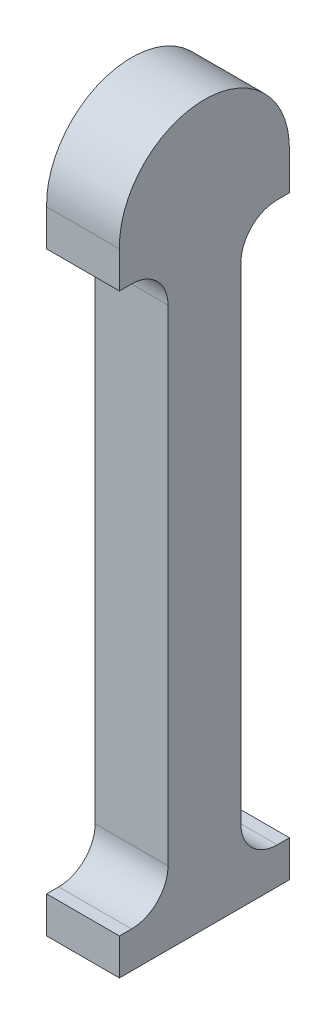
ISO-10303-21;
HEADER;
FILE_DESCRIPTION(('STEP AP214'),'2;1');
FILE_NAME('part.step','',(''),(''),'','','');
FILE_SCHEMA(('AUTOMOTIVE_DESIGN { 1 0 10303 214 1 1 1 1 }'));
ENDSEC;
DATA;
#1=APPLICATION_CONTEXT('core data for automotive mechanical design processes');
#2=APPLICATION_PROTOCOL_DEFINITION('international standard','automotive_design',2000,#1);
#3=PRODUCT_CONTEXT('',#1,'mechanical');
#4=PRODUCT('Part','Part','',(#3));
#5=PRODUCT_RELATED_PRODUCT_CATEGORY('part','',(#4));
#6=PRODUCT_DEFINITION_FORMATION('','',#4);
#7=PRODUCT_DEFINITION_CONTEXT('part definition',#1,'design');
#8=PRODUCT_DEFINITION('design','',#6,#7);
#9=PRODUCT_DEFINITION_SHAPE('','',#8);
#10=(LENGTH_UNIT() NAMED_UNIT(*) SI_UNIT(.MILLI.,.METRE.));
#11=(NAMED_UNIT(*) PLANE_ANGLE_UNIT() SI_UNIT($,.RADIAN.));
#12=(NAMED_UNIT(*) SI_UNIT($,.STERADIAN.) SOLID_ANGLE_UNIT());
#13=UNCERTAINTY_MEASURE_WITH_UNIT(LENGTH_MEASURE(1.E-05),#10,'distance_accuracy_value','');
#14=(GEOMETRIC_REPRESENTATION_CONTEXT(3) GLOBAL_UNCERTAINTY_ASSIGNED_CONTEXT((#13)) GLOBAL_UNIT_ASSIGNED_CONTEXT((#10,
#11,#12)) REPRESENTATION_CONTEXT('',''));
#15=CARTESIAN_POINT('',(0.,0.,0.));
#16=DIRECTION('',(0.,0.,1.));
#17=DIRECTION('',(1.,0.,0.));
#18=AXIS2_PLACEMENT_3D('',#15,#16,#17);
#19=CARTESIAN_POINT('',(1.5,23.,1.5));
#20=DIRECTION('',(-1.,0.,0.));
#21=DIRECTION('',(0.,0.,1.));
#22=AXIS2_PLACEMENT_3D('',#19,#20,#21);
#23=PLANE('',#22);
#24=DIRECTION('',(0.,0.,-1.));
#25=VECTOR('',#24,1.);
#26=CARTESIAN_POINT('',(1.5,23.,-3.5));
#27=LINE('',#26,#25);
#28=CARTESIAN_POINT('',(1.5,23.,3.5));
#29=VERTEX_POINT('',#28);
#30=CARTESIAN_POINT('',(1.5,23.,3.));
#31=VERTEX_POINT('',#30);
#32=EDGE_CURVE('E235',#29,#31,#27,.T.);
#33=ORIENTED_EDGE('',*,*,#32,.T.);
#34=CARTESIAN_POINT('',(1.5,21.5,3.));
#35=DIRECTION('',(-1.,0.,0.));
#36=DIRECTION('',(0.,0.,1.));
#37=AXIS2_PLACEMENT_3D('',#34,#35,#36);
#38=CIRCLE('',#37,1.5);
#39=CARTESIAN_POINT('',(1.5,21.5,1.5));
#40=VERTEX_POINT('',#39);
#41=EDGE_CURVE('E48',#31,#40,#38,.T.);
#42=ORIENTED_EDGE('',*,*,#41,.T.);
#43=DIRECTION('',(0.,-1.,0.));
#44=VECTOR('',#43,1.);
#45=CARTESIAN_POINT('',(1.5,23.,1.5));
#46=LINE('',#45,#44);
#47=CARTESIAN_POINT('',(1.5,1.5,1.5));
#48=VERTEX_POINT('',#47);
#49=EDGE_CURVE('E255',#40,#48,#46,.T.);
#50=ORIENTED_EDGE('',*,*,#49,.T.);
#51=CARTESIAN_POINT('',(1.5,1.5,3.));
#52=DIRECTION('',(-1.,0.,0.));
#53=DIRECTION('',(0.,0.,1.));
#54=AXIS2_PLACEMENT_3D('',#51,#52,#53);
#55=CIRCLE('',#54,1.5);
#56=CARTESIAN_POINT('',(1.5,0.,3.));
#57=VERTEX_POINT('',#56);
#58=EDGE_CURVE('E298',#48,#57,#55,.T.);
#59=ORIENTED_EDGE('',*,*,#58,.T.);
#60=DIRECTION('',(0.,0.,-1.));
#61=VECTOR('',#60,1.);
#62=CARTESIAN_POINT('',(1.5,0.,-3.5));
#63=LINE('',#62,#61);
#64=CARTESIAN_POINT('',(1.5,0.,3.5));
#65=VERTEX_POINT('',#64);
#66=EDGE_CURVE('E202',#65,#57,#63,.T.);
#67=ORIENTED_EDGE('',*,*,#66,.F.);
#68=DIRECTION('',(0.,1.,0.));
#69=VECTOR('',#68,1.);
#70=CARTESIAN_POINT('',(1.5,-1.5,3.5));
#71=LINE('',#70,#69);
#72=CARTESIAN_POINT('',(1.5,-1.5,3.5));
#73=VERTEX_POINT('',#72);
#74=EDGE_CURVE('E228',#73,#65,#71,.T.);
#75=ORIENTED_EDGE('',*,*,#74,.F.);
#76=DIRECTION('',(0.,0.,-1.));
#77=VECTOR('',#76,1.);
#78=CARTESIAN_POINT('',(1.5,-1.5,-3.5));
#79=LINE('',#78,#77);
#80=CARTESIAN_POINT('',(1.5,-1.5,-3.5));
#81=VERTEX_POINT('',#80);
#82=EDGE_CURVE('E184',#73,#81,#79,.T.);
#83=ORIENTED_EDGE('',*,*,#82,.T.);
#84=DIRECTION('',(0.,1.,0.));
#85=VECTOR('',#84,1.);
#86=CARTESIAN_POINT('',(1.5,-1.5,-3.5));
#87=LINE('',#86,#85);
#88=CARTESIAN_POINT('',(1.5,0.,-3.5));
#89=VERTEX_POINT('',#88);
#90=EDGE_CURVE('E201',#81,#89,#87,.T.);
#91=ORIENTED_EDGE('',*,*,#90,.T.);
#92=CARTESIAN_POINT('',(1.5,0.,-3.));
#93=VERTEX_POINT('',#92);
#94=EDGE_CURVE('E181',#93,#89,#63,.T.);
#95=ORIENTED_EDGE('',*,*,#94,.F.);
#96=CARTESIAN_POINT('',(1.5,1.5,-3.));
#97=DIRECTION('',(-1.,0.,0.));
#98=DIRECTION('',(0.,0.,1.));
#99=AXIS2_PLACEMENT_3D('',#96,#97,#98);
#100=CIRCLE('',#99,1.5);
#101=CARTESIAN_POINT('',(1.5,1.5,-1.5));
#102=VERTEX_POINT('',#101);
#103=EDGE_CURVE('E307',#93,#102,#100,.T.);
#104=ORIENTED_EDGE('',*,*,#103,.T.);
#105=DIRECTION('',(0.,-1.,0.));
#106=VECTOR('',#105,1.);
#107=CARTESIAN_POINT('',(1.5,23.,-1.5));
#108=LINE('',#107,#106);
#109=CARTESIAN_POINT('',(1.5,21.5,-1.5));
#110=VERTEX_POINT('',#109);
#111=EDGE_CURVE('E267',#110,#102,#108,.T.);
#112=ORIENTED_EDGE('',*,*,#111,.F.);
#113=CARTESIAN_POINT('',(1.5,21.5,-3.));
#114=DIRECTION('',(-1.,0.,0.));
#115=DIRECTION('',(0.,0.,1.));
#116=AXIS2_PLACEMENT_3D('',#113,#114,#115);
#117=CIRCLE('',#116,1.5);
#118=CARTESIAN_POINT('',(1.5,23.,-3.));
#119=VERTEX_POINT('',#118);
#120=EDGE_CURVE('E313',#110,#119,#117,.T.);
#121=ORIENTED_EDGE('',*,*,#120,.T.);
#122=CARTESIAN_POINT('',(1.5,23.,-3.5));
#123=VERTEX_POINT('',#122);
#124=EDGE_CURVE('E231',#119,#123,#27,.T.);
#125=ORIENTED_EDGE('',*,*,#124,.T.);
#126=DIRECTION('',(0.,-1.,0.));
#127=VECTOR('',#126,1.);
#128=CARTESIAN_POINT('',(1.5,24.5,-3.5));
#129=LINE('',#128,#127);
#130=CARTESIAN_POINT('',(1.5,24.5,-3.5));
#131=VERTEX_POINT('',#130);
#132=EDGE_CURVE('E251',#131,#123,#129,.T.);
#133=ORIENTED_EDGE('',*,*,#132,.F.);
#134=CARTESIAN_POINT('',(1.5,24.5767224444418,0.));
#135=DIRECTION('',(-1.,0.,0.));
#136=DIRECTION('',(0.,0.,1.));
#137=AXIS2_PLACEMENT_3D('',#134,#135,#136);
#138=CIRCLE('',#137,3.50084080379002);
#139=CARTESIAN_POINT('',(1.5,24.5,3.5));
#140=VERTEX_POINT('',#139);
#141=EDGE_CURVE('E178',#140,#131,#138,.T.);
#142=ORIENTED_EDGE('',*,*,#141,.F.);
#143=DIRECTION('',(0.,-1.,0.));
#144=VECTOR('',#143,1.);
#145=CARTESIAN_POINT('',(1.5,24.5,3.5));
#146=LINE('',#145,#144);
#147=EDGE_CURVE('E158',#140,#29,#146,.T.);
#148=ORIENTED_EDGE('',*,*,#147,.T.);
#149=EDGE_LOOP('',(#33,#42,#50,#59,#67,#75,#83,#91,#95,#104,#112,#121,#125,#133,#142,#148));
#150=FACE_BOUND('',#149,.T.);
#151=ADVANCED_FACE('F39',(#150),#23,.F.);
#152=CARTESIAN_POINT('',(-1.5,23.,-1.5));
#153=DIRECTION('',(0.,0.,1.));
#154=DIRECTION('',(1.,0.,0.));
#155=AXIS2_PLACEMENT_3D('',#152,#153,#154);
#156=PLANE('',#155);
#157=ORIENTED_EDGE('',*,*,#111,.T.);
#158=DIRECTION('',(-1.,0.,0.));
#159=VECTOR('',#158,1.);
#160=CARTESIAN_POINT('',(-1.5,1.5,-1.5));
#161=LINE('',#160,#159);
#162=CARTESIAN_POINT('',(-1.5,1.5,-1.5));
#163=VERTEX_POINT('',#162);
#164=EDGE_CURVE('E284',#102,#163,#161,.T.);
#165=ORIENTED_EDGE('',*,*,#164,.T.);
#166=DIRECTION('',(0.,-1.,0.));
#167=VECTOR('',#166,1.);
#168=CARTESIAN_POINT('',(-1.5,23.,-1.5));
#169=LINE('',#168,#167);
#170=CARTESIAN_POINT('',(-1.5,21.5,-1.5));
#171=VERTEX_POINT('',#170);
#172=EDGE_CURVE('E263',#171,#163,#169,.T.);
#173=ORIENTED_EDGE('',*,*,#172,.F.);
#174=DIRECTION('',(-1.,0.,0.));
#175=VECTOR('',#174,1.);
#176=CARTESIAN_POINT('',(1.5,21.5,-1.5));
#177=LINE('',#176,#175);
#178=EDGE_CURVE('E281',#171,#110,#177,.F.);
#179=ORIENTED_EDGE('',*,*,#178,.T.);
#180=EDGE_LOOP('',(#157,#165,#173,#179));
#181=FACE_BOUND('',#180,.T.);
#182=ADVANCED_FACE('F346',(#181),#156,.F.);
#183=CARTESIAN_POINT('',(-1.5,23.,1.5));
#184=DIRECTION('',(1.,0.,0.));
#185=DIRECTION('',(0.,0.,-1.));
#186=AXIS2_PLACEMENT_3D('',#183,#184,#185);
#187=PLANE('',#186);
#188=DIRECTION('',(0.,0.,1.));
#189=VECTOR('',#188,1.);
#190=CARTESIAN_POINT('',(-1.5,23.,-3.5));
#191=LINE('',#190,#189);
#192=CARTESIAN_POINT('',(-1.5,23.,-3.5));
#193=VERTEX_POINT('',#192);
#194=CARTESIAN_POINT('',(-1.5,23.,-3.));
#195=VERTEX_POINT('',#194);
#196=EDGE_CURVE('E242',#193,#195,#191,.T.);
#197=ORIENTED_EDGE('',*,*,#196,.T.);
#198=CARTESIAN_POINT('',(-1.5,21.5,-3.));
#199=DIRECTION('',(1.,0.,0.));
#200=DIRECTION('',(0.,0.,-1.));
#201=AXIS2_PLACEMENT_3D('',#198,#199,#200);
#202=CIRCLE('',#201,1.5);
#203=EDGE_CURVE('E310',#195,#171,#202,.T.);
#204=ORIENTED_EDGE('',*,*,#203,.T.);
#205=ORIENTED_EDGE('',*,*,#172,.T.);
#206=CARTESIAN_POINT('',(-1.5,1.5,-3.));
#207=DIRECTION('',(1.,0.,0.));
#208=DIRECTION('',(0.,0.,-1.));
#209=AXIS2_PLACEMENT_3D('',#206,#207,#208);
#210=CIRCLE('',#209,1.5);
#211=CARTESIAN_POINT('',(-1.5,0.,-3.));
#212=VERTEX_POINT('',#211);
#213=EDGE_CURVE('E304',#163,#212,#210,.T.);
#214=ORIENTED_EDGE('',*,*,#213,.T.);
#215=DIRECTION('',(0.,0.,1.));
#216=VECTOR('',#215,1.);
#217=CARTESIAN_POINT('',(-1.5,0.,-3.5));
#218=LINE('',#217,#216);
#219=CARTESIAN_POINT('',(-1.5,0.,-3.5));
#220=VERTEX_POINT('',#219);
#221=EDGE_CURVE('E211',#220,#212,#218,.T.);
#222=ORIENTED_EDGE('',*,*,#221,.F.);
#223=DIRECTION('',(0.,1.,0.));
#224=VECTOR('',#223,1.);
#225=CARTESIAN_POINT('',(-1.5,-1.5,-3.5));
#226=LINE('',#225,#224);
#227=CARTESIAN_POINT('',(-1.5,-1.5,-3.5));
#228=VERTEX_POINT('',#227);
#229=EDGE_CURVE('E221',#228,#220,#226,.T.);
#230=ORIENTED_EDGE('',*,*,#229,.F.);
#231=DIRECTION('',(0.,0.,1.));
#232=VECTOR('',#231,1.);
#233=CARTESIAN_POINT('',(-1.5,-1.5,-3.5));
#234=LINE('',#233,#232);
#235=CARTESIAN_POINT('',(-1.5,-1.5,3.5));
#236=VERTEX_POINT('',#235);
#237=EDGE_CURVE('E193',#228,#236,#234,.T.);
#238=ORIENTED_EDGE('',*,*,#237,.T.);
#239=DIRECTION('',(0.,1.,0.));
#240=VECTOR('',#239,1.);
#241=CARTESIAN_POINT('',(-1.5,-1.5,3.5));
#242=LINE('',#241,#240);
#243=CARTESIAN_POINT('',(-1.5,0.,3.5));
#244=VERTEX_POINT('',#243);
#245=EDGE_CURVE('E224',#236,#244,#242,.T.);
#246=ORIENTED_EDGE('',*,*,#245,.T.);
#247=CARTESIAN_POINT('',(-1.5,0.,3.));
#248=VERTEX_POINT('',#247);
#249=EDGE_CURVE('E210',#248,#244,#218,.T.);
#250=ORIENTED_EDGE('',*,*,#249,.F.);
#251=CARTESIAN_POINT('',(-1.5,1.5,3.));
#252=DIRECTION('',(1.,0.,0.));
#253=DIRECTION('',(0.,0.,-1.));
#254=AXIS2_PLACEMENT_3D('',#251,#252,#253);
#255=CIRCLE('',#254,1.5);
#256=CARTESIAN_POINT('',(-1.5,1.5,1.5));
#257=VERTEX_POINT('',#256);
#258=EDGE_CURVE('E301',#248,#257,#255,.T.);
#259=ORIENTED_EDGE('',*,*,#258,.T.);
#260=DIRECTION('',(0.,-1.,0.));
#261=VECTOR('',#260,1.);
#262=CARTESIAN_POINT('',(-1.5,23.,1.5));
#263=LINE('',#262,#261);
#264=CARTESIAN_POINT('',(-1.5,21.5,1.5));
#265=VERTEX_POINT('',#264);
#266=EDGE_CURVE('E259',#265,#257,#263,.T.);
#267=ORIENTED_EDGE('',*,*,#266,.F.);
#268=CARTESIAN_POINT('',(-1.5,21.5,3.));
#269=DIRECTION('',(1.,0.,0.));
#270=DIRECTION('',(0.,0.,-1.));
#271=AXIS2_PLACEMENT_3D('',#268,#269,#270);
#272=CIRCLE('',#271,1.5);
#273=CARTESIAN_POINT('',(-1.5,23.,3.));
#274=VERTEX_POINT('',#273);
#275=EDGE_CURVE('E11',#265,#274,#272,.T.);
#276=ORIENTED_EDGE('',*,*,#275,.T.);
#277=CARTESIAN_POINT('',(-1.5,23.,3.5));
#278=VERTEX_POINT('',#277);
#279=EDGE_CURVE('E171',#274,#278,#191,.T.);
#280=ORIENTED_EDGE('',*,*,#279,.T.);
#281=DIRECTION('',(0.,-1.,0.));
#282=VECTOR('',#281,1.);
#283=CARTESIAN_POINT('',(-1.5,24.5,3.5));
#284=LINE('',#283,#282);
#285=CARTESIAN_POINT('',(-1.5,24.5,3.5));
#286=VERTEX_POINT('',#285);
#287=EDGE_CURVE('E155',#286,#278,#284,.T.);
#288=ORIENTED_EDGE('',*,*,#287,.F.);
#289=CARTESIAN_POINT('',(-1.5,24.5767224444418,0.));
#290=DIRECTION('',(-1.,0.,0.));
#291=DIRECTION('',(0.,0.,1.));
#292=AXIS2_PLACEMENT_3D('',#289,#290,#291);
#293=CIRCLE('',#292,3.50084080379002);
#294=CARTESIAN_POINT('',(-1.5,24.5,-3.5));
#295=VERTEX_POINT('',#294);
#296=EDGE_CURVE('E170',#286,#295,#293,.T.);
#297=ORIENTED_EDGE('',*,*,#296,.T.);
#298=DIRECTION('',(0.,-1.,0.));
#299=VECTOR('',#298,1.);
#300=CARTESIAN_POINT('',(-1.5,24.5,-3.5));
#301=LINE('',#300,#299);
#302=EDGE_CURVE('E173',#295,#193,#301,.T.);
#303=ORIENTED_EDGE('',*,*,#302,.T.);
#304=EDGE_LOOP('',(#197,#204,#205,#214,#222,#230,#238,#246,#250,#259,#267,#276,#280,#288,#297,#303));
#305=FACE_BOUND('',#304,.T.);
#306=ADVANCED_FACE('F168',(#305),#187,.F.);
#307=CARTESIAN_POINT('',(-1.5,23.,1.5));
#308=DIRECTION('',(0.,0.,-1.));
#309=DIRECTION('',(-1.,0.,0.));
#310=AXIS2_PLACEMENT_3D('',#307,#308,#309);
#311=PLANE('',#310);
#312=ORIENTED_EDGE('',*,*,#266,.T.);
#313=DIRECTION('',(1.,0.,0.));
#314=VECTOR('',#313,1.);
#315=CARTESIAN_POINT('',(1.5,1.5,1.5));
#316=LINE('',#315,#314);
#317=EDGE_CURVE('E274',#257,#48,#316,.T.);
#318=ORIENTED_EDGE('',*,*,#317,.T.);
#319=ORIENTED_EDGE('',*,*,#49,.F.);
#320=DIRECTION('',(1.,0.,0.));
#321=VECTOR('',#320,1.);
#322=CARTESIAN_POINT('',(-1.5,21.5,1.5));
#323=LINE('',#322,#321);
#324=EDGE_CURVE('E271',#40,#265,#323,.F.);
#325=ORIENTED_EDGE('',*,*,#324,.T.);
#326=EDGE_LOOP('',(#312,#318,#319,#325));
#327=FACE_BOUND('',#326,.T.);
#328=ADVANCED_FACE('F320',(#327),#311,.F.);
#329=CARTESIAN_POINT('',(0.,23.,0.));
#330=DIRECTION('',(0.,1.,0.));
#331=DIRECTION('',(0.,0.,1.));
#332=AXIS2_PLACEMENT_3D('',#329,#330,#331);
#333=PLANE('',#332);
#334=ORIENTED_EDGE('',*,*,#124,.F.);
#335=DIRECTION('',(-1.,0.,0.));
#336=VECTOR('',#335,1.);
#337=CARTESIAN_POINT('',(-1.5,23.,-3.));
#338=LINE('',#337,#336);
#339=EDGE_CURVE('E291',#119,#195,#338,.T.);
#340=ORIENTED_EDGE('',*,*,#339,.T.);
#341=ORIENTED_EDGE('',*,*,#196,.F.);
#342=DIRECTION('',(-1.,0.,0.));
#343=VECTOR('',#342,1.);
#344=CARTESIAN_POINT('',(-1.5,23.,-3.5));
#345=LINE('',#344,#343);
#346=EDGE_CURVE('E239',#123,#193,#345,.T.);
#347=ORIENTED_EDGE('',*,*,#346,.F.);
#348=EDGE_LOOP('',(#334,#340,#341,#347));
#349=FACE_BOUND('',#348,.T.);
#350=ADVANCED_FACE('F356',(#349),#333,.F.);
#351=ORIENTED_EDGE('',*,*,#279,.F.);
#352=DIRECTION('',(1.,0.,0.));
#353=VECTOR('',#352,1.);
#354=CARTESIAN_POINT('',(1.5,23.,3.));
#355=LINE('',#354,#353);
#356=EDGE_CURVE('E295',#274,#31,#355,.T.);
#357=ORIENTED_EDGE('',*,*,#356,.T.);
#358=ORIENTED_EDGE('',*,*,#32,.F.);
#359=DIRECTION('',(1.,0.,0.));
#360=VECTOR('',#359,1.);
#361=CARTESIAN_POINT('',(-1.5,23.,3.5));
#362=LINE('',#361,#360);
#363=EDGE_CURVE('E233',#278,#29,#362,.T.);
#364=ORIENTED_EDGE('',*,*,#363,.F.);
#365=EDGE_LOOP('',(#351,#357,#358,#364));
#366=FACE_BOUND('',#365,.T.);
#367=ADVANCED_FACE('F323',(#366),#333,.F.);
#368=CARTESIAN_POINT('',(-1.5,24.5,-3.5));
#369=DIRECTION('',(0.,0.,1.));
#370=DIRECTION('',(1.,0.,0.));
#371=AXIS2_PLACEMENT_3D('',#368,#369,#370);
#372=PLANE('',#371);
#373=ORIENTED_EDGE('',*,*,#346,.T.);
#374=ORIENTED_EDGE('',*,*,#302,.F.);
#375=DIRECTION('',(-1.,0.,0.));
#376=VECTOR('',#375,1.);
#377=CARTESIAN_POINT('',(-1.5,24.5,-3.5));
#378=LINE('',#377,#376);
#379=EDGE_CURVE('E164',#131,#295,#378,.T.);
#380=ORIENTED_EDGE('',*,*,#379,.F.);
#381=ORIENTED_EDGE('',*,*,#132,.T.);
#382=EDGE_LOOP('',(#373,#374,#380,#381));
#383=FACE_BOUND('',#382,.T.);
#384=ADVANCED_FACE('F359',(#383),#372,.F.);
#385=CARTESIAN_POINT('',(-1.5,24.5,3.5));
#386=DIRECTION('',(0.,0.,-1.));
#387=DIRECTION('',(-1.,0.,0.));
#388=AXIS2_PLACEMENT_3D('',#385,#386,#387);
#389=PLANE('',#388);
#390=ORIENTED_EDGE('',*,*,#363,.T.);
#391=ORIENTED_EDGE('',*,*,#147,.F.);
#392=DIRECTION('',(1.,0.,0.));
#393=VECTOR('',#392,1.);
#394=CARTESIAN_POINT('',(-1.5,24.5,3.5));
#395=LINE('',#394,#393);
#396=EDGE_CURVE('E152',#286,#140,#395,.T.);
#397=ORIENTED_EDGE('',*,*,#396,.F.);
#398=ORIENTED_EDGE('',*,*,#287,.T.);
#399=EDGE_LOOP('',(#390,#391,#397,#398));
#400=FACE_BOUND('',#399,.T.);
#401=ADVANCED_FACE('F154',(#400),#389,.F.);
#402=CARTESIAN_POINT('',(0.,0.,0.));
#403=DIRECTION('',(0.,-1.,0.));
#404=DIRECTION('',(0.,0.,1.));
#405=AXIS2_PLACEMENT_3D('',#402,#403,#404);
#406=PLANE('',#405);
#407=ORIENTED_EDGE('',*,*,#66,.T.);
#408=DIRECTION('',(1.,0.,0.));
#409=VECTOR('',#408,1.);
#410=CARTESIAN_POINT('',(-1.5,0.,3.));
#411=LINE('',#410,#409);
#412=EDGE_CURVE('E278',#57,#248,#411,.F.);
#413=ORIENTED_EDGE('',*,*,#412,.T.);
#414=ORIENTED_EDGE('',*,*,#249,.T.);
#415=DIRECTION('',(1.,0.,0.));
#416=VECTOR('',#415,1.);
#417=CARTESIAN_POINT('',(-1.5,0.,3.5));
#418=LINE('',#417,#416);
#419=EDGE_CURVE('E206',#244,#65,#418,.T.);
#420=ORIENTED_EDGE('',*,*,#419,.T.);
#421=EDGE_LOOP('',(#407,#413,#414,#420));
#422=FACE_BOUND('',#421,.T.);
#423=ADVANCED_FACE('F366',(#422),#406,.F.);
#424=CARTESIAN_POINT('',(-1.5,-1.5,3.5));
#425=DIRECTION('',(0.,0.,1.));
#426=DIRECTION('',(1.,0.,0.));
#427=AXIS2_PLACEMENT_3D('',#424,#425,#426);
#428=PLANE('',#427);
#429=ORIENTED_EDGE('',*,*,#419,.F.);
#430=ORIENTED_EDGE('',*,*,#245,.F.);
#431=DIRECTION('',(1.,0.,0.));
#432=VECTOR('',#431,1.);
#433=CARTESIAN_POINT('',(-1.5,-1.5,3.5));
#434=LINE('',#433,#432);
#435=EDGE_CURVE('E188',#236,#73,#434,.T.);
#436=ORIENTED_EDGE('',*,*,#435,.T.);
#437=ORIENTED_EDGE('',*,*,#74,.T.);
#438=EDGE_LOOP('',(#429,#430,#436,#437));
#439=FACE_BOUND('',#438,.T.);
#440=ADVANCED_FACE('F402',(#439),#428,.T.);
#441=CARTESIAN_POINT('',(-1.5,-1.5,-3.5));
#442=DIRECTION('',(0.,0.,-1.));
#443=DIRECTION('',(-1.,0.,0.));
#444=AXIS2_PLACEMENT_3D('',#441,#442,#443);
#445=PLANE('',#444);
#446=DIRECTION('',(-1.,0.,0.));
#447=VECTOR('',#446,1.);
#448=CARTESIAN_POINT('',(-1.5,0.,-3.5));
#449=LINE('',#448,#447);
#450=EDGE_CURVE('E189',#89,#220,#449,.T.);
#451=ORIENTED_EDGE('',*,*,#450,.F.);
#452=ORIENTED_EDGE('',*,*,#90,.F.);
#453=DIRECTION('',(-1.,0.,0.));
#454=VECTOR('',#453,1.);
#455=CARTESIAN_POINT('',(-1.5,-1.5,-3.5));
#456=LINE('',#455,#454);
#457=EDGE_CURVE('E197',#81,#228,#456,.T.);
#458=ORIENTED_EDGE('',*,*,#457,.T.);
#459=ORIENTED_EDGE('',*,*,#229,.T.);
#460=EDGE_LOOP('',(#451,#452,#458,#459));
#461=FACE_BOUND('',#460,.T.);
#462=ADVANCED_FACE('F337',(#461),#445,.T.);
#463=CARTESIAN_POINT('',(0.,-1.5,0.));
#464=DIRECTION('',(0.,-1.,0.));
#465=DIRECTION('',(0.,0.,1.));
#466=AXIS2_PLACEMENT_3D('',#463,#464,#465);
#467=PLANE('',#466);
#468=ORIENTED_EDGE('',*,*,#82,.F.);
#469=ORIENTED_EDGE('',*,*,#435,.F.);
#470=ORIENTED_EDGE('',*,*,#237,.F.);
#471=ORIENTED_EDGE('',*,*,#457,.F.);
#472=EDGE_LOOP('',(#468,#469,#470,#471));
#473=FACE_BOUND('',#472,.T.);
#474=ADVANCED_FACE('F394',(#473),#467,.T.);
#475=ORIENTED_EDGE('',*,*,#221,.T.);
#476=DIRECTION('',(-1.,0.,0.));
#477=VECTOR('',#476,1.);
#478=CARTESIAN_POINT('',(1.5,0.,-3.));
#479=LINE('',#478,#477);
#480=EDGE_CURVE('E288',#212,#93,#479,.F.);
#481=ORIENTED_EDGE('',*,*,#480,.T.);
#482=ORIENTED_EDGE('',*,*,#94,.T.);
#483=ORIENTED_EDGE('',*,*,#450,.T.);
#484=EDGE_LOOP('',(#475,#481,#482,#483));
#485=FACE_BOUND('',#484,.T.);
#486=ADVANCED_FACE('F330',(#485),#406,.F.);
#487=CARTESIAN_POINT('',(-1.5,1.5,3.));
#488=DIRECTION('',(-1.,0.,0.));
#489=DIRECTION('',(0.,0.,1.));
#490=AXIS2_PLACEMENT_3D('',#487,#488,#489);
#491=CYLINDRICAL_SURFACE('',#490,1.5);
#492=ORIENTED_EDGE('',*,*,#258,.F.);
#493=ORIENTED_EDGE('',*,*,#412,.F.);
#494=ORIENTED_EDGE('',*,*,#58,.F.);
#495=ORIENTED_EDGE('',*,*,#317,.F.);
#496=EDGE_LOOP('',(#492,#493,#494,#495));
#497=FACE_BOUND('',#496,.T.);
#498=ADVANCED_FACE('F378',(#497),#491,.F.);
#499=CARTESIAN_POINT('',(-1.5,1.5,-3.));
#500=DIRECTION('',(1.,0.,0.));
#501=DIRECTION('',(0.,0.,-1.));
#502=AXIS2_PLACEMENT_3D('',#499,#500,#501);
#503=CYLINDRICAL_SURFACE('',#502,1.5);
#504=ORIENTED_EDGE('',*,*,#103,.F.);
#505=ORIENTED_EDGE('',*,*,#480,.F.);
#506=ORIENTED_EDGE('',*,*,#213,.F.);
#507=ORIENTED_EDGE('',*,*,#164,.F.);
#508=EDGE_LOOP('',(#504,#505,#506,#507));
#509=FACE_BOUND('',#508,.T.);
#510=ADVANCED_FACE('F341',(#509),#503,.F.);
#511=CARTESIAN_POINT('',(0.,21.5,-3.));
#512=DIRECTION('',(1.,0.,0.));
#513=DIRECTION('',(0.,0.,-1.));
#514=AXIS2_PLACEMENT_3D('',#511,#512,#513);
#515=CYLINDRICAL_SURFACE('',#514,1.5);
#516=ORIENTED_EDGE('',*,*,#120,.F.);
#517=ORIENTED_EDGE('',*,*,#178,.F.);
#518=ORIENTED_EDGE('',*,*,#203,.F.);
#519=ORIENTED_EDGE('',*,*,#339,.F.);
#520=EDGE_LOOP('',(#516,#517,#518,#519));
#521=FACE_BOUND('',#520,.T.);
#522=ADVANCED_FACE('F350',(#521),#515,.F.);
#523=CARTESIAN_POINT('',(0.,21.5,3.));
#524=DIRECTION('',(-1.,0.,0.));
#525=DIRECTION('',(0.,0.,1.));
#526=AXIS2_PLACEMENT_3D('',#523,#524,#525);
#527=CYLINDRICAL_SURFACE('',#526,1.5);
#528=ORIENTED_EDGE('',*,*,#275,.F.);
#529=ORIENTED_EDGE('',*,*,#324,.F.);
#530=ORIENTED_EDGE('',*,*,#41,.F.);
#531=ORIENTED_EDGE('',*,*,#356,.F.);
#532=EDGE_LOOP('',(#528,#529,#530,#531));
#533=FACE_BOUND('',#532,.T.);
#534=ADVANCED_FACE('F41',(#533),#527,.F.);
#535=CARTESIAN_POINT('',(1.5,24.5767224444418,0.));
#536=DIRECTION('',(-1.,0.,0.));
#537=DIRECTION('',(0.,0.,1.));
#538=AXIS2_PLACEMENT_3D('',#535,#536,#537);
#539=CYLINDRICAL_SURFACE('',#538,3.50084080379002);
#540=ORIENTED_EDGE('',*,*,#296,.F.);
#541=ORIENTED_EDGE('',*,*,#396,.T.);
#542=ORIENTED_EDGE('',*,*,#141,.T.);
#543=ORIENTED_EDGE('',*,*,#379,.T.);
#544=EDGE_LOOP('',(#540,#541,#542,#543));
#545=FACE_BOUND('',#544,.T.);
#546=ADVANCED_FACE('F176',(#545),#539,.T.);
#547=CLOSED_SHELL('',(#151,#182,#306,#328,#350,#367,#384,#401,#423,#440,#462,#474,#486,#498,
#510,#522,#534,#546));
#548=MANIFOLD_SOLID_BREP('B2',#547);
#549=ADVANCED_BREP_SHAPE_REPRESENTATION('',(#18,#548),#14);
#550=SHAPE_DEFINITION_REPRESENTATION(#9,#549);
ENDSEC;
END-ISO-10303-21;
